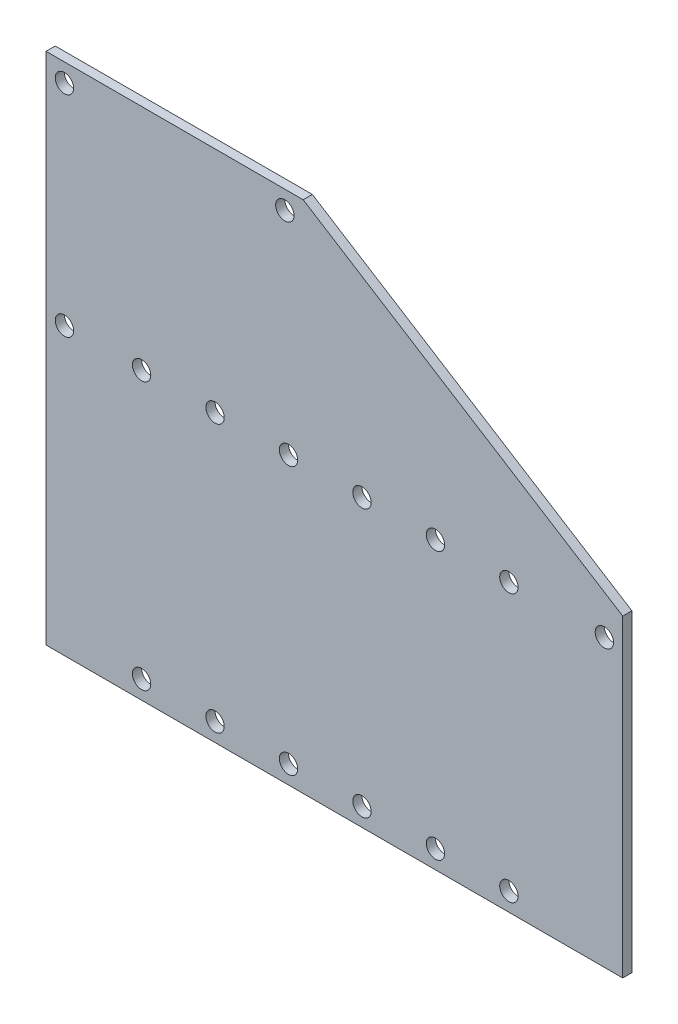
ISO-10303-21;
HEADER;
FILE_DESCRIPTION(('STEP AP214'),'2;1');
FILE_NAME('part.step','',(''),(''),'','','');
FILE_SCHEMA(('AUTOMOTIVE_DESIGN { 1 0 10303 214 1 1 1 1 }'));
ENDSEC;
DATA;
#1=APPLICATION_CONTEXT('core data for automotive mechanical design processes');
#2=APPLICATION_PROTOCOL_DEFINITION('international standard','automotive_design',2000,#1);
#3=PRODUCT_CONTEXT('',#1,'mechanical');
#4=PRODUCT('Part','Part','',(#3));
#5=PRODUCT_RELATED_PRODUCT_CATEGORY('part','',(#4));
#6=PRODUCT_DEFINITION_FORMATION('','',#4);
#7=PRODUCT_DEFINITION_CONTEXT('part definition',#1,'design');
#8=PRODUCT_DEFINITION('design','',#6,#7);
#9=PRODUCT_DEFINITION_SHAPE('','',#8);
#10=(LENGTH_UNIT() NAMED_UNIT(*) SI_UNIT(.MILLI.,.METRE.));
#11=(NAMED_UNIT(*) PLANE_ANGLE_UNIT() SI_UNIT($,.RADIAN.));
#12=(NAMED_UNIT(*) SI_UNIT($,.STERADIAN.) SOLID_ANGLE_UNIT());
#13=UNCERTAINTY_MEASURE_WITH_UNIT(LENGTH_MEASURE(1.E-05),#10,'distance_accuracy_value','');
#14=(GEOMETRIC_REPRESENTATION_CONTEXT(3) GLOBAL_UNCERTAINTY_ASSIGNED_CONTEXT((#13)) GLOBAL_UNIT_ASSIGNED_CONTEXT((#10,
#11,#12)) REPRESENTATION_CONTEXT('',''));
#15=CARTESIAN_POINT('',(0.,0.,0.));
#16=DIRECTION('',(0.,0.,1.));
#17=DIRECTION('',(1.,0.,0.));
#18=AXIS2_PLACEMENT_3D('',#15,#16,#17);
#19=CARTESIAN_POINT('',(-99.695,-88.9,3.175));
#20=DIRECTION('',(-1.,0.,0.));
#21=DIRECTION('',(0.,0.,1.));
#22=AXIS2_PLACEMENT_3D('',#19,#20,#21);
#23=PLANE('',#22);
#24=DIRECTION('',(0.,1.,0.));
#25=VECTOR('',#24,1.);
#26=CARTESIAN_POINT('',(-99.695,-88.9,0.));
#27=LINE('',#26,#25);
#28=CARTESIAN_POINT('',(-99.695,-88.9,0.));
#29=VERTEX_POINT('',#28);
#30=CARTESIAN_POINT('',(-99.695,88.9,0.));
#31=VERTEX_POINT('',#30);
#32=EDGE_CURVE('E106',#29,#31,#27,.T.);
#33=ORIENTED_EDGE('',*,*,#32,.F.);
#34=DIRECTION('',(0.,0.,-1.));
#35=VECTOR('',#34,1.);
#36=CARTESIAN_POINT('',(-99.695,-88.9,3.175));
#37=LINE('',#36,#35);
#38=CARTESIAN_POINT('',(-99.695,-88.9,3.175));
#39=VERTEX_POINT('',#38);
#40=EDGE_CURVE('E11',#39,#29,#37,.T.);
#41=ORIENTED_EDGE('',*,*,#40,.F.);
#42=DIRECTION('',(0.,1.,0.));
#43=VECTOR('',#42,1.);
#44=CARTESIAN_POINT('',(-99.695,-88.9,3.175));
#45=LINE('',#44,#43);
#46=CARTESIAN_POINT('',(-99.695,88.9,3.175));
#47=VERTEX_POINT('',#46);
#48=EDGE_CURVE('E116',#39,#47,#45,.T.);
#49=ORIENTED_EDGE('',*,*,#48,.T.);
#50=DIRECTION('',(0.,0.,-1.));
#51=VECTOR('',#50,1.);
#52=CARTESIAN_POINT('',(-99.695,88.9,3.175));
#53=LINE('',#52,#51);
#54=EDGE_CURVE('E44',#47,#31,#53,.T.);
#55=ORIENTED_EDGE('',*,*,#54,.T.);
#56=EDGE_LOOP('',(#33,#41,#49,#55));
#57=FACE_BOUND('',#56,.T.);
#58=ADVANCED_FACE('F41',(#57),#23,.T.);
#59=CARTESIAN_POINT('',(-99.695,-88.9,3.175));
#60=DIRECTION('',(0.,1.,0.));
#61=DIRECTION('',(0.,0.,1.));
#62=AXIS2_PLACEMENT_3D('',#59,#60,#61);
#63=PLANE('',#62);
#64=DIRECTION('',(1.,0.,0.));
#65=VECTOR('',#64,1.);
#66=CARTESIAN_POINT('',(-99.695,-88.9,0.));
#67=LINE('',#66,#65);
#68=CARTESIAN_POINT('',(99.695,-88.9,0.));
#69=VERTEX_POINT('',#68);
#70=EDGE_CURVE('E111',#29,#69,#67,.T.);
#71=ORIENTED_EDGE('',*,*,#70,.T.);
#72=DIRECTION('',(0.,0.,-1.));
#73=VECTOR('',#72,1.);
#74=CARTESIAN_POINT('',(99.695,-88.9,3.175));
#75=LINE('',#74,#73);
#76=CARTESIAN_POINT('',(99.695,-88.9,3.175));
#77=VERTEX_POINT('',#76);
#78=EDGE_CURVE('E49',#77,#69,#75,.T.);
#79=ORIENTED_EDGE('',*,*,#78,.F.);
#80=DIRECTION('',(1.,0.,0.));
#81=VECTOR('',#80,1.);
#82=CARTESIAN_POINT('',(-99.695,-88.9,3.175));
#83=LINE('',#82,#81);
#84=EDGE_CURVE('E121',#39,#77,#83,.T.);
#85=ORIENTED_EDGE('',*,*,#84,.F.);
#86=ORIENTED_EDGE('',*,*,#40,.T.);
#87=EDGE_LOOP('',(#71,#79,#85,#86));
#88=FACE_BOUND('',#87,.T.);
#89=ADVANCED_FACE('F247',(#88),#63,.F.);
#90=CARTESIAN_POINT('',(99.695,-88.9,3.175));
#91=DIRECTION('',(-1.,0.,0.));
#92=DIRECTION('',(0.,0.,1.));
#93=AXIS2_PLACEMENT_3D('',#90,#91,#92);
#94=PLANE('',#93);
#95=DIRECTION('',(0.,1.,0.));
#96=VECTOR('',#95,1.);
#97=CARTESIAN_POINT('',(99.695,-88.9,0.));
#98=LINE('',#97,#96);
#99=CARTESIAN_POINT('',(99.695,19.474999912,0.));
#100=VERTEX_POINT('',#99);
#101=EDGE_CURVE('E109',#69,#100,#98,.T.);
#102=ORIENTED_EDGE('',*,*,#101,.T.);
#103=DIRECTION('',(0.,0.,1.));
#104=VECTOR('',#103,1.);
#105=CARTESIAN_POINT('',(99.695,19.474999912,0.));
#106=LINE('',#105,#104);
#107=CARTESIAN_POINT('',(99.695,19.474999912,3.175));
#108=VERTEX_POINT('',#107);
#109=EDGE_CURVE('E57',#100,#108,#106,.T.);
#110=ORIENTED_EDGE('',*,*,#109,.T.);
#111=DIRECTION('',(0.,1.,0.));
#112=VECTOR('',#111,1.);
#113=CARTESIAN_POINT('',(99.695,-88.9,3.175));
#114=LINE('',#113,#112);
#115=EDGE_CURVE('E122',#77,#108,#114,.T.);
#116=ORIENTED_EDGE('',*,*,#115,.F.);
#117=ORIENTED_EDGE('',*,*,#78,.T.);
#118=EDGE_LOOP('',(#102,#110,#116,#117));
#119=FACE_BOUND('',#118,.T.);
#120=ADVANCED_FACE('F245',(#119),#94,.F.);
#121=CARTESIAN_POINT('',(-99.695,88.9,3.175));
#122=DIRECTION('',(0.,1.,0.));
#123=DIRECTION('',(0.,0.,1.));
#124=AXIS2_PLACEMENT_3D('',#121,#122,#123);
#125=PLANE('',#124);
#126=DIRECTION('',(0.,0.,1.));
#127=VECTOR('',#126,1.);
#128=CARTESIAN_POINT('',(-10.795,88.9,0.));
#129=LINE('',#128,#127);
#130=CARTESIAN_POINT('',(-10.795,88.9,0.));
#131=VERTEX_POINT('',#130);
#132=CARTESIAN_POINT('',(-10.795,88.9,3.175));
#133=VERTEX_POINT('',#132);
#134=EDGE_CURVE('E94',#131,#133,#129,.T.);
#135=ORIENTED_EDGE('',*,*,#134,.F.);
#136=DIRECTION('',(1.,0.,0.));
#137=VECTOR('',#136,1.);
#138=CARTESIAN_POINT('',(-99.695,88.9,0.));
#139=LINE('',#138,#137);
#140=EDGE_CURVE('E103',#31,#131,#139,.T.);
#141=ORIENTED_EDGE('',*,*,#140,.F.);
#142=ORIENTED_EDGE('',*,*,#54,.F.);
#143=DIRECTION('',(1.,0.,0.));
#144=VECTOR('',#143,1.);
#145=CARTESIAN_POINT('',(-99.695,88.9,3.175));
#146=LINE('',#145,#144);
#147=EDGE_CURVE('E105',#47,#133,#146,.T.);
#148=ORIENTED_EDGE('',*,*,#147,.T.);
#149=EDGE_LOOP('',(#135,#141,#142,#148));
#150=FACE_BOUND('',#149,.T.);
#151=ADVANCED_FACE('F102',(#150),#125,.T.);
#152=CARTESIAN_POINT('',(0.,0.,3.175));
#153=DIRECTION('',(0.,0.,-1.));
#154=DIRECTION('',(-1.,0.,0.));
#155=AXIS2_PLACEMENT_3D('',#152,#153,#154);
#156=PLANE('',#155);
#157=CARTESIAN_POINT('',(-66.675,9.94999991200002,3.175));
#158=DIRECTION('',(0.,0.,1.));
#159=DIRECTION('',(1.,0.,0.));
#160=AXIS2_PLACEMENT_3D('',#157,#158,#159);
#161=CIRCLE('',#160,3.175);
#162=CARTESIAN_POINT('',(-63.5,9.94999991200002,3.175));
#163=VERTEX_POINT('',#162);
#164=EDGE_CURVE('E155',#163,#163,#161,.T.);
#165=ORIENTED_EDGE('',*,*,#164,.F.);
#166=EDGE_LOOP('',(#165));
#167=FACE_BOUND('',#166,.T.);
#168=CARTESIAN_POINT('',(-17.145,82.55,3.175));
#169=DIRECTION('',(0.,0.,1.));
#170=DIRECTION('',(1.,0.,0.));
#171=AXIS2_PLACEMENT_3D('',#168,#169,#170);
#172=CIRCLE('',#171,3.175);
#173=CARTESIAN_POINT('',(-13.97,82.55,3.175));
#174=VERTEX_POINT('',#173);
#175=EDGE_CURVE('E166',#174,#174,#172,.T.);
#176=ORIENTED_EDGE('',*,*,#175,.F.);
#177=EDGE_LOOP('',(#176));
#178=FACE_BOUND('',#177,.T.);
#179=CARTESIAN_POINT('',(-41.275,9.94999991200002,3.175));
#180=DIRECTION('',(0.,0.,1.));
#181=DIRECTION('',(1.,0.,0.));
#182=AXIS2_PLACEMENT_3D('',#179,#180,#181);
#183=CIRCLE('',#182,3.175);
#184=CARTESIAN_POINT('',(-38.1,9.94999991200002,3.175));
#185=VERTEX_POINT('',#184);
#186=EDGE_CURVE('E167',#185,#185,#183,.T.);
#187=ORIENTED_EDGE('',*,*,#186,.F.);
#188=EDGE_LOOP('',(#187));
#189=FACE_BOUND('',#188,.T.);
#190=CARTESIAN_POINT('',(-15.875,9.94999991200002,3.175));
#191=DIRECTION('',(0.,0.,1.));
#192=DIRECTION('',(1.,0.,0.));
#193=AXIS2_PLACEMENT_3D('',#190,#191,#192);
#194=CIRCLE('',#193,3.175);
#195=CARTESIAN_POINT('',(-12.7,9.94999991200002,3.175));
#196=VERTEX_POINT('',#195);
#197=EDGE_CURVE('E178',#196,#196,#194,.T.);
#198=ORIENTED_EDGE('',*,*,#197,.F.);
#199=EDGE_LOOP('',(#198));
#200=FACE_BOUND('',#199,.T.);
#201=CARTESIAN_POINT('',(-41.275,-82.55,3.175));
#202=DIRECTION('',(0.,0.,1.));
#203=DIRECTION('',(1.,0.,0.));
#204=AXIS2_PLACEMENT_3D('',#201,#202,#203);
#205=CIRCLE('',#204,3.175);
#206=CARTESIAN_POINT('',(-38.1,-82.55,3.175));
#207=VERTEX_POINT('',#206);
#208=EDGE_CURVE('E136',#207,#207,#205,.T.);
#209=ORIENTED_EDGE('',*,*,#208,.F.);
#210=EDGE_LOOP('',(#209));
#211=FACE_BOUND('',#210,.T.);
#212=CARTESIAN_POINT('',(-93.345,82.55,3.175));
#213=DIRECTION('',(0.,0.,1.));
#214=DIRECTION('',(1.,0.,0.));
#215=AXIS2_PLACEMENT_3D('',#212,#213,#214);
#216=CIRCLE('',#215,3.175);
#217=CARTESIAN_POINT('',(-90.17,82.55,3.175));
#218=VERTEX_POINT('',#217);
#219=EDGE_CURVE('E142',#218,#218,#216,.T.);
#220=ORIENTED_EDGE('',*,*,#219,.F.);
#221=EDGE_LOOP('',(#220));
#222=FACE_BOUND('',#221,.T.);
#223=CARTESIAN_POINT('',(-93.345,9.94999991200002,3.175));
#224=DIRECTION('',(0.,0.,1.));
#225=DIRECTION('',(1.,0.,0.));
#226=AXIS2_PLACEMENT_3D('',#223,#224,#225);
#227=CIRCLE('',#226,3.175);
#228=CARTESIAN_POINT('',(-90.17,9.94999991200002,3.175));
#229=VERTEX_POINT('',#228);
#230=EDGE_CURVE('E143',#229,#229,#227,.T.);
#231=ORIENTED_EDGE('',*,*,#230,.F.);
#232=EDGE_LOOP('',(#231));
#233=FACE_BOUND('',#232,.T.);
#234=CARTESIAN_POINT('',(93.345,9.94999991200002,3.175));
#235=DIRECTION('',(0.,0.,1.));
#236=DIRECTION('',(1.,0.,0.));
#237=AXIS2_PLACEMENT_3D('',#234,#235,#236);
#238=CIRCLE('',#237,3.175);
#239=CARTESIAN_POINT('',(96.52,9.94999991200002,3.175));
#240=VERTEX_POINT('',#239);
#241=EDGE_CURVE('E154',#240,#240,#238,.T.);
#242=ORIENTED_EDGE('',*,*,#241,.F.);
#243=EDGE_LOOP('',(#242));
#244=FACE_BOUND('',#243,.T.);
#245=CARTESIAN_POINT('',(60.325,-82.55,3.175));
#246=DIRECTION('',(0.,0.,1.));
#247=DIRECTION('',(1.,0.,0.));
#248=AXIS2_PLACEMENT_3D('',#245,#246,#247);
#249=CIRCLE('',#248,3.175);
#250=CARTESIAN_POINT('',(63.5,-82.55,3.175));
#251=VERTEX_POINT('',#250);
#252=EDGE_CURVE('E214',#251,#251,#249,.T.);
#253=ORIENTED_EDGE('',*,*,#252,.F.);
#254=EDGE_LOOP('',(#253));
#255=FACE_BOUND('',#254,.T.);
#256=CARTESIAN_POINT('',(34.925,-82.55,3.175));
#257=DIRECTION('',(0.,0.,1.));
#258=DIRECTION('',(1.,0.,0.));
#259=AXIS2_PLACEMENT_3D('',#256,#257,#258);
#260=CIRCLE('',#259,3.175);
#261=CARTESIAN_POINT('',(38.1,-82.55,3.175));
#262=VERTEX_POINT('',#261);
#263=EDGE_CURVE('E220',#262,#262,#260,.T.);
#264=ORIENTED_EDGE('',*,*,#263,.F.);
#265=EDGE_LOOP('',(#264));
#266=FACE_BOUND('',#265,.T.);
#267=CARTESIAN_POINT('',(9.52499999999998,-82.55,3.175));
#268=DIRECTION('',(0.,0.,1.));
#269=DIRECTION('',(1.,0.,0.));
#270=AXIS2_PLACEMENT_3D('',#267,#268,#269);
#271=CIRCLE('',#270,3.175);
#272=CARTESIAN_POINT('',(12.7,-82.55,3.175));
#273=VERTEX_POINT('',#272);
#274=EDGE_CURVE('E203',#273,#273,#271,.T.);
#275=ORIENTED_EDGE('',*,*,#274,.F.);
#276=EDGE_LOOP('',(#275));
#277=FACE_BOUND('',#276,.T.);
#278=CARTESIAN_POINT('',(9.52499999999995,9.94999991200002,3.175));
#279=DIRECTION('',(0.,0.,1.));
#280=DIRECTION('',(1.,0.,0.));
#281=AXIS2_PLACEMENT_3D('',#278,#279,#280);
#282=CIRCLE('',#281,3.175);
#283=CARTESIAN_POINT('',(12.6999999999999,9.94999991200002,3.175));
#284=VERTEX_POINT('',#283);
#285=EDGE_CURVE('E179',#284,#284,#282,.T.);
#286=ORIENTED_EDGE('',*,*,#285,.F.);
#287=EDGE_LOOP('',(#286));
#288=FACE_BOUND('',#287,.T.);
#289=CARTESIAN_POINT('',(34.9249999999999,9.94999991200002,3.175));
#290=DIRECTION('',(0.,0.,1.));
#291=DIRECTION('',(1.,0.,0.));
#292=AXIS2_PLACEMENT_3D('',#289,#290,#291);
#293=CIRCLE('',#292,3.175);
#294=CARTESIAN_POINT('',(38.0999999999999,9.94999991200002,3.175));
#295=VERTEX_POINT('',#294);
#296=EDGE_CURVE('E190',#295,#295,#293,.T.);
#297=ORIENTED_EDGE('',*,*,#296,.F.);
#298=EDGE_LOOP('',(#297));
#299=FACE_BOUND('',#298,.T.);
#300=CARTESIAN_POINT('',(60.3249999999999,9.94999991200002,3.175));
#301=DIRECTION('',(0.,0.,1.));
#302=DIRECTION('',(1.,0.,0.));
#303=AXIS2_PLACEMENT_3D('',#300,#301,#302);
#304=CIRCLE('',#303,3.175);
#305=CARTESIAN_POINT('',(63.4999999999999,9.94999991200002,3.175));
#306=VERTEX_POINT('',#305);
#307=EDGE_CURVE('E191',#306,#306,#304,.T.);
#308=ORIENTED_EDGE('',*,*,#307,.F.);
#309=EDGE_LOOP('',(#308));
#310=FACE_BOUND('',#309,.T.);
#311=CARTESIAN_POINT('',(-15.875,-82.55,3.175));
#312=DIRECTION('',(0.,0.,1.));
#313=DIRECTION('',(1.,0.,0.));
#314=AXIS2_PLACEMENT_3D('',#311,#312,#313);
#315=CIRCLE('',#314,3.175);
#316=CARTESIAN_POINT('',(-12.7,-82.55,3.175));
#317=VERTEX_POINT('',#316);
#318=EDGE_CURVE('E202',#317,#317,#315,.T.);
#319=ORIENTED_EDGE('',*,*,#318,.F.);
#320=EDGE_LOOP('',(#319));
#321=FACE_BOUND('',#320,.T.);
#322=CARTESIAN_POINT('',(-66.675,-82.55,3.175));
#323=DIRECTION('',(0.,0.,1.));
#324=DIRECTION('',(1.,0.,0.));
#325=AXIS2_PLACEMENT_3D('',#322,#323,#324);
#326=CIRCLE('',#325,3.175);
#327=CARTESIAN_POINT('',(-63.5,-82.55,3.175));
#328=VERTEX_POINT('',#327);
#329=EDGE_CURVE('E133',#328,#328,#326,.T.);
#330=ORIENTED_EDGE('',*,*,#329,.F.);
#331=EDGE_LOOP('',(#330));
#332=FACE_BOUND('',#331,.T.);
#333=ORIENTED_EDGE('',*,*,#115,.T.);
#334=DIRECTION('',(0.846725815933061,-0.532029503535746,0.));
#335=VECTOR('',#334,1.);
#336=CARTESIAN_POINT('',(-10.795,88.9,3.175));
#337=LINE('',#336,#335);
#338=EDGE_CURVE('E100',#133,#108,#337,.T.);
#339=ORIENTED_EDGE('',*,*,#338,.F.);
#340=ORIENTED_EDGE('',*,*,#147,.F.);
#341=ORIENTED_EDGE('',*,*,#48,.F.);
#342=ORIENTED_EDGE('',*,*,#84,.T.);
#343=EDGE_LOOP('',(#333,#339,#340,#341,#342));
#344=FACE_BOUND('',#343,.T.);
#345=ADVANCED_FACE('F231',(#167,#178,#189,#200,#211,#222,#233,#244,#255,#266,#277,#288,#299,
#310,#321,#332,#344),#156,.F.);
#346=CARTESIAN_POINT('',(0.,0.,0.));
#347=DIRECTION('',(0.,0.,-1.));
#348=DIRECTION('',(-1.,0.,0.));
#349=AXIS2_PLACEMENT_3D('',#346,#347,#348);
#350=PLANE('',#349);
#351=CARTESIAN_POINT('',(-66.675,9.94999991200002,0.));
#352=DIRECTION('',(0.,0.,1.));
#353=DIRECTION('',(1.,0.,0.));
#354=AXIS2_PLACEMENT_3D('',#351,#352,#353);
#355=CIRCLE('',#354,3.175);
#356=CARTESIAN_POINT('',(-63.5,9.94999991200002,0.));
#357=VERTEX_POINT('',#356);
#358=EDGE_CURVE('E170',#357,#357,#355,.T.);
#359=ORIENTED_EDGE('',*,*,#358,.T.);
#360=EDGE_LOOP('',(#359));
#361=FACE_BOUND('',#360,.T.);
#362=CARTESIAN_POINT('',(-17.145,82.55,0.));
#363=DIRECTION('',(0.,0.,1.));
#364=DIRECTION('',(1.,0.,0.));
#365=AXIS2_PLACEMENT_3D('',#362,#363,#364);
#366=CIRCLE('',#365,3.175);
#367=CARTESIAN_POINT('',(-13.97,82.55,0.));
#368=VERTEX_POINT('',#367);
#369=EDGE_CURVE('E163',#368,#368,#366,.T.);
#370=ORIENTED_EDGE('',*,*,#369,.T.);
#371=EDGE_LOOP('',(#370));
#372=FACE_BOUND('',#371,.T.);
#373=CARTESIAN_POINT('',(-41.275,9.94999991200002,0.));
#374=DIRECTION('',(0.,0.,1.));
#375=DIRECTION('',(1.,0.,0.));
#376=AXIS2_PLACEMENT_3D('',#373,#374,#375);
#377=CIRCLE('',#376,3.175);
#378=CARTESIAN_POINT('',(-38.1,9.94999991200002,0.));
#379=VERTEX_POINT('',#378);
#380=EDGE_CURVE('E182',#379,#379,#377,.T.);
#381=ORIENTED_EDGE('',*,*,#380,.T.);
#382=EDGE_LOOP('',(#381));
#383=FACE_BOUND('',#382,.T.);
#384=CARTESIAN_POINT('',(-15.875,9.94999991200002,0.));
#385=DIRECTION('',(0.,0.,1.));
#386=DIRECTION('',(1.,0.,0.));
#387=AXIS2_PLACEMENT_3D('',#384,#385,#386);
#388=CIRCLE('',#387,3.175);
#389=CARTESIAN_POINT('',(-12.7,9.94999991200002,0.));
#390=VERTEX_POINT('',#389);
#391=EDGE_CURVE('E175',#390,#390,#388,.T.);
#392=ORIENTED_EDGE('',*,*,#391,.T.);
#393=EDGE_LOOP('',(#392));
#394=FACE_BOUND('',#393,.T.);
#395=CARTESIAN_POINT('',(-41.275,-82.55,0.));
#396=DIRECTION('',(0.,0.,1.));
#397=DIRECTION('',(1.,0.,0.));
#398=AXIS2_PLACEMENT_3D('',#395,#396,#397);
#399=CIRCLE('',#398,3.175);
#400=CARTESIAN_POINT('',(-38.1,-82.55,0.));
#401=VERTEX_POINT('',#400);
#402=EDGE_CURVE('E146',#401,#401,#399,.T.);
#403=ORIENTED_EDGE('',*,*,#402,.T.);
#404=EDGE_LOOP('',(#403));
#405=FACE_BOUND('',#404,.T.);
#406=CARTESIAN_POINT('',(-93.345,82.55,0.));
#407=DIRECTION('',(0.,0.,1.));
#408=DIRECTION('',(1.,0.,0.));
#409=AXIS2_PLACEMENT_3D('',#406,#407,#408);
#410=CIRCLE('',#409,3.175);
#411=CARTESIAN_POINT('',(-90.17,82.55,0.));
#412=VERTEX_POINT('',#411);
#413=EDGE_CURVE('E139',#412,#412,#410,.T.);
#414=ORIENTED_EDGE('',*,*,#413,.T.);
#415=EDGE_LOOP('',(#414));
#416=FACE_BOUND('',#415,.T.);
#417=CARTESIAN_POINT('',(-93.345,9.94999991200002,0.));
#418=DIRECTION('',(0.,0.,1.));
#419=DIRECTION('',(1.,0.,0.));
#420=AXIS2_PLACEMENT_3D('',#417,#418,#419);
#421=CIRCLE('',#420,3.175);
#422=CARTESIAN_POINT('',(-90.17,9.94999991200002,0.));
#423=VERTEX_POINT('',#422);
#424=EDGE_CURVE('E158',#423,#423,#421,.T.);
#425=ORIENTED_EDGE('',*,*,#424,.T.);
#426=EDGE_LOOP('',(#425));
#427=FACE_BOUND('',#426,.T.);
#428=CARTESIAN_POINT('',(93.345,9.94999991200002,0.));
#429=DIRECTION('',(0.,0.,1.));
#430=DIRECTION('',(1.,0.,0.));
#431=AXIS2_PLACEMENT_3D('',#428,#429,#430);
#432=CIRCLE('',#431,3.175);
#433=CARTESIAN_POINT('',(96.52,9.94999991200002,0.));
#434=VERTEX_POINT('',#433);
#435=EDGE_CURVE('E151',#434,#434,#432,.T.);
#436=ORIENTED_EDGE('',*,*,#435,.T.);
#437=EDGE_LOOP('',(#436));
#438=FACE_BOUND('',#437,.T.);
#439=CARTESIAN_POINT('',(60.325,-82.55,0.));
#440=DIRECTION('',(0.,0.,1.));
#441=DIRECTION('',(1.,0.,0.));
#442=AXIS2_PLACEMENT_3D('',#439,#440,#441);
#443=CIRCLE('',#442,3.175);
#444=CARTESIAN_POINT('',(63.5,-82.55,0.));
#445=VERTEX_POINT('',#444);
#446=EDGE_CURVE('E211',#445,#445,#443,.T.);
#447=ORIENTED_EDGE('',*,*,#446,.T.);
#448=EDGE_LOOP('',(#447));
#449=FACE_BOUND('',#448,.T.);
#450=CARTESIAN_POINT('',(34.925,-82.55,0.));
#451=DIRECTION('',(0.,0.,1.));
#452=DIRECTION('',(1.,0.,0.));
#453=AXIS2_PLACEMENT_3D('',#450,#451,#452);
#454=CIRCLE('',#453,3.175);
#455=CARTESIAN_POINT('',(38.1,-82.55,0.));
#456=VERTEX_POINT('',#455);
#457=EDGE_CURVE('E217',#456,#456,#454,.T.);
#458=ORIENTED_EDGE('',*,*,#457,.T.);
#459=EDGE_LOOP('',(#458));
#460=FACE_BOUND('',#459,.T.);
#461=CARTESIAN_POINT('',(9.52499999999998,-82.55,0.));
#462=DIRECTION('',(0.,0.,1.));
#463=DIRECTION('',(1.,0.,0.));
#464=AXIS2_PLACEMENT_3D('',#461,#462,#463);
#465=CIRCLE('',#464,3.175);
#466=CARTESIAN_POINT('',(12.7,-82.55,0.));
#467=VERTEX_POINT('',#466);
#468=EDGE_CURVE('E223',#467,#467,#465,.T.);
#469=ORIENTED_EDGE('',*,*,#468,.T.);
#470=EDGE_LOOP('',(#469));
#471=FACE_BOUND('',#470,.T.);
#472=CARTESIAN_POINT('',(9.52499999999995,9.94999991200002,0.));
#473=DIRECTION('',(0.,0.,1.));
#474=DIRECTION('',(1.,0.,0.));
#475=AXIS2_PLACEMENT_3D('',#472,#473,#474);
#476=CIRCLE('',#475,3.175);
#477=CARTESIAN_POINT('',(12.6999999999999,9.94999991200002,0.));
#478=VERTEX_POINT('',#477);
#479=EDGE_CURVE('E194',#478,#478,#476,.T.);
#480=ORIENTED_EDGE('',*,*,#479,.T.);
#481=EDGE_LOOP('',(#480));
#482=FACE_BOUND('',#481,.T.);
#483=CARTESIAN_POINT('',(34.9249999999999,9.94999991200002,0.));
#484=DIRECTION('',(0.,0.,1.));
#485=DIRECTION('',(1.,0.,0.));
#486=AXIS2_PLACEMENT_3D('',#483,#484,#485);
#487=CIRCLE('',#486,3.175);
#488=CARTESIAN_POINT('',(38.0999999999999,9.94999991200002,0.));
#489=VERTEX_POINT('',#488);
#490=EDGE_CURVE('E187',#489,#489,#487,.T.);
#491=ORIENTED_EDGE('',*,*,#490,.T.);
#492=EDGE_LOOP('',(#491));
#493=FACE_BOUND('',#492,.T.);
#494=CARTESIAN_POINT('',(60.3249999999999,9.94999991200002,0.));
#495=DIRECTION('',(0.,0.,1.));
#496=DIRECTION('',(1.,0.,0.));
#497=AXIS2_PLACEMENT_3D('',#494,#495,#496);
#498=CIRCLE('',#497,3.175);
#499=CARTESIAN_POINT('',(63.4999999999999,9.94999991200002,0.));
#500=VERTEX_POINT('',#499);
#501=EDGE_CURVE('E206',#500,#500,#498,.T.);
#502=ORIENTED_EDGE('',*,*,#501,.T.);
#503=EDGE_LOOP('',(#502));
#504=FACE_BOUND('',#503,.T.);
#505=CARTESIAN_POINT('',(-15.875,-82.55,0.));
#506=DIRECTION('',(0.,0.,1.));
#507=DIRECTION('',(1.,0.,0.));
#508=AXIS2_PLACEMENT_3D('',#505,#506,#507);
#509=CIRCLE('',#508,3.175);
#510=CARTESIAN_POINT('',(-12.7,-82.55,0.));
#511=VERTEX_POINT('',#510);
#512=EDGE_CURVE('E199',#511,#511,#509,.T.);
#513=ORIENTED_EDGE('',*,*,#512,.T.);
#514=EDGE_LOOP('',(#513));
#515=FACE_BOUND('',#514,.T.);
#516=CARTESIAN_POINT('',(-66.675,-82.55,0.));
#517=DIRECTION('',(0.,0.,1.));
#518=DIRECTION('',(1.,0.,0.));
#519=AXIS2_PLACEMENT_3D('',#516,#517,#518);
#520=CIRCLE('',#519,3.175);
#521=CARTESIAN_POINT('',(-63.5,-82.55,0.));
#522=VERTEX_POINT('',#521);
#523=EDGE_CURVE('E131',#522,#522,#520,.T.);
#524=ORIENTED_EDGE('',*,*,#523,.T.);
#525=EDGE_LOOP('',(#524));
#526=FACE_BOUND('',#525,.T.);
#527=DIRECTION('',(0.846725815933061,-0.532029503535746,0.));
#528=VECTOR('',#527,1.);
#529=CARTESIAN_POINT('',(-10.795,88.9,0.));
#530=LINE('',#529,#528);
#531=EDGE_CURVE('E91',#131,#100,#530,.T.);
#532=ORIENTED_EDGE('',*,*,#531,.T.);
#533=ORIENTED_EDGE('',*,*,#101,.F.);
#534=ORIENTED_EDGE('',*,*,#70,.F.);
#535=ORIENTED_EDGE('',*,*,#32,.T.);
#536=ORIENTED_EDGE('',*,*,#140,.T.);
#537=EDGE_LOOP('',(#532,#533,#534,#535,#536));
#538=FACE_BOUND('',#537,.T.);
#539=ADVANCED_FACE('F108',(#361,#372,#383,#394,#405,#416,#427,#438,#449,#460,#471,#482,#493,
#504,#515,#526,#538),#350,.T.);
#540=CARTESIAN_POINT('',(-10.795,88.9,0.));
#541=DIRECTION('',(-0.532029503535746,-0.846725815933061,0.));
#542=DIRECTION('',(0.846725815933061,-0.532029503535746,0.));
#543=AXIS2_PLACEMENT_3D('',#540,#541,#542);
#544=PLANE('',#543);
#545=ORIENTED_EDGE('',*,*,#338,.T.);
#546=ORIENTED_EDGE('',*,*,#109,.F.);
#547=ORIENTED_EDGE('',*,*,#531,.F.);
#548=ORIENTED_EDGE('',*,*,#134,.T.);
#549=EDGE_LOOP('',(#545,#546,#547,#548));
#550=FACE_BOUND('',#549,.T.);
#551=ADVANCED_FACE('F93',(#550),#544,.F.);
#552=CARTESIAN_POINT('',(-66.675,-82.55,0.));
#553=DIRECTION('',(0.,0.,1.));
#554=DIRECTION('',(1.,0.,0.));
#555=AXIS2_PLACEMENT_3D('',#552,#553,#554);
#556=CYLINDRICAL_SURFACE('',#555,3.175);
#557=ORIENTED_EDGE('',*,*,#523,.F.);
#558=EDGE_LOOP('',(#557));
#559=FACE_BOUND('',#558,.T.);
#560=ORIENTED_EDGE('',*,*,#329,.T.);
#561=EDGE_LOOP('',(#560));
#562=FACE_BOUND('',#561,.T.);
#563=ADVANCED_FACE('F269',(#559,#562),#556,.F.);
#564=CARTESIAN_POINT('',(-15.875,-82.55,0.));
#565=DIRECTION('',(0.,0.,1.));
#566=DIRECTION('',(1.,0.,0.));
#567=AXIS2_PLACEMENT_3D('',#564,#565,#566);
#568=CYLINDRICAL_SURFACE('',#567,3.175);
#569=ORIENTED_EDGE('',*,*,#512,.F.);
#570=EDGE_LOOP('',(#569));
#571=FACE_BOUND('',#570,.T.);
#572=ORIENTED_EDGE('',*,*,#318,.T.);
#573=EDGE_LOOP('',(#572));
#574=FACE_BOUND('',#573,.T.);
#575=ADVANCED_FACE('F289',(#571,#574),#568,.F.);
#576=CARTESIAN_POINT('',(60.3249999999999,9.94999991200002,0.));
#577=DIRECTION('',(0.,0.,1.));
#578=DIRECTION('',(1.,0.,0.));
#579=AXIS2_PLACEMENT_3D('',#576,#577,#578);
#580=CYLINDRICAL_SURFACE('',#579,3.175);
#581=ORIENTED_EDGE('',*,*,#501,.F.);
#582=EDGE_LOOP('',(#581));
#583=FACE_BOUND('',#582,.T.);
#584=ORIENTED_EDGE('',*,*,#307,.T.);
#585=EDGE_LOOP('',(#584));
#586=FACE_BOUND('',#585,.T.);
#587=ADVANCED_FACE('F298',(#583,#586),#580,.F.);
#588=CARTESIAN_POINT('',(34.9249999999999,9.94999991200002,0.));
#589=DIRECTION('',(0.,0.,1.));
#590=DIRECTION('',(1.,0.,0.));
#591=AXIS2_PLACEMENT_3D('',#588,#589,#590);
#592=CYLINDRICAL_SURFACE('',#591,3.175);
#593=ORIENTED_EDGE('',*,*,#490,.F.);
#594=EDGE_LOOP('',(#593));
#595=FACE_BOUND('',#594,.T.);
#596=ORIENTED_EDGE('',*,*,#296,.T.);
#597=EDGE_LOOP('',(#596));
#598=FACE_BOUND('',#597,.T.);
#599=ADVANCED_FACE('F307',(#595,#598),#592,.F.);
#600=CARTESIAN_POINT('',(9.52499999999995,9.94999991200002,0.));
#601=DIRECTION('',(0.,0.,1.));
#602=DIRECTION('',(1.,0.,0.));
#603=AXIS2_PLACEMENT_3D('',#600,#601,#602);
#604=CYLINDRICAL_SURFACE('',#603,3.175);
#605=ORIENTED_EDGE('',*,*,#479,.F.);
#606=EDGE_LOOP('',(#605));
#607=FACE_BOUND('',#606,.T.);
#608=ORIENTED_EDGE('',*,*,#285,.T.);
#609=EDGE_LOOP('',(#608));
#610=FACE_BOUND('',#609,.T.);
#611=ADVANCED_FACE('F316',(#607,#610),#604,.F.);
#612=CARTESIAN_POINT('',(9.52499999999998,-82.55,0.));
#613=DIRECTION('',(0.,0.,1.));
#614=DIRECTION('',(1.,0.,0.));
#615=AXIS2_PLACEMENT_3D('',#612,#613,#614);
#616=CYLINDRICAL_SURFACE('',#615,3.175);
#617=ORIENTED_EDGE('',*,*,#468,.F.);
#618=EDGE_LOOP('',(#617));
#619=FACE_BOUND('',#618,.T.);
#620=ORIENTED_EDGE('',*,*,#274,.T.);
#621=EDGE_LOOP('',(#620));
#622=FACE_BOUND('',#621,.T.);
#623=ADVANCED_FACE('F229',(#619,#622),#616,.F.);
#624=CARTESIAN_POINT('',(34.925,-82.55,0.));
#625=DIRECTION('',(0.,0.,1.));
#626=DIRECTION('',(1.,0.,0.));
#627=AXIS2_PLACEMENT_3D('',#624,#625,#626);
#628=CYLINDRICAL_SURFACE('',#627,3.175);
#629=ORIENTED_EDGE('',*,*,#457,.F.);
#630=EDGE_LOOP('',(#629));
#631=FACE_BOUND('',#630,.T.);
#632=ORIENTED_EDGE('',*,*,#263,.T.);
#633=EDGE_LOOP('',(#632));
#634=FACE_BOUND('',#633,.T.);
#635=ADVANCED_FACE('F333',(#631,#634),#628,.F.);
#636=CARTESIAN_POINT('',(60.325,-82.55,0.));
#637=DIRECTION('',(0.,0.,1.));
#638=DIRECTION('',(1.,0.,0.));
#639=AXIS2_PLACEMENT_3D('',#636,#637,#638);
#640=CYLINDRICAL_SURFACE('',#639,3.175);
#641=ORIENTED_EDGE('',*,*,#446,.F.);
#642=EDGE_LOOP('',(#641));
#643=FACE_BOUND('',#642,.T.);
#644=ORIENTED_EDGE('',*,*,#252,.T.);
#645=EDGE_LOOP('',(#644));
#646=FACE_BOUND('',#645,.T.);
#647=ADVANCED_FACE('F342',(#643,#646),#640,.F.);
#648=CARTESIAN_POINT('',(93.345,9.94999991200002,0.));
#649=DIRECTION('',(0.,0.,1.));
#650=DIRECTION('',(1.,0.,0.));
#651=AXIS2_PLACEMENT_3D('',#648,#649,#650);
#652=CYLINDRICAL_SURFACE('',#651,3.175);
#653=ORIENTED_EDGE('',*,*,#435,.F.);
#654=EDGE_LOOP('',(#653));
#655=FACE_BOUND('',#654,.T.);
#656=ORIENTED_EDGE('',*,*,#241,.T.);
#657=EDGE_LOOP('',(#656));
#658=FACE_BOUND('',#657,.T.);
#659=ADVANCED_FACE('F351',(#655,#658),#652,.F.);
#660=CARTESIAN_POINT('',(-93.345,9.94999991200002,0.));
#661=DIRECTION('',(0.,0.,1.));
#662=DIRECTION('',(1.,0.,0.));
#663=AXIS2_PLACEMENT_3D('',#660,#661,#662);
#664=CYLINDRICAL_SURFACE('',#663,3.175);
#665=ORIENTED_EDGE('',*,*,#424,.F.);
#666=EDGE_LOOP('',(#665));
#667=FACE_BOUND('',#666,.T.);
#668=ORIENTED_EDGE('',*,*,#230,.T.);
#669=EDGE_LOOP('',(#668));
#670=FACE_BOUND('',#669,.T.);
#671=ADVANCED_FACE('F360',(#667,#670),#664,.F.);
#672=CARTESIAN_POINT('',(-93.345,82.55,0.));
#673=DIRECTION('',(0.,0.,1.));
#674=DIRECTION('',(1.,0.,0.));
#675=AXIS2_PLACEMENT_3D('',#672,#673,#674);
#676=CYLINDRICAL_SURFACE('',#675,3.175);
#677=ORIENTED_EDGE('',*,*,#413,.F.);
#678=EDGE_LOOP('',(#677));
#679=FACE_BOUND('',#678,.T.);
#680=ORIENTED_EDGE('',*,*,#219,.T.);
#681=EDGE_LOOP('',(#680));
#682=FACE_BOUND('',#681,.T.);
#683=ADVANCED_FACE('F369',(#679,#682),#676,.F.);
#684=CARTESIAN_POINT('',(-41.275,-82.55,0.));
#685=DIRECTION('',(0.,0.,1.));
#686=DIRECTION('',(1.,0.,0.));
#687=AXIS2_PLACEMENT_3D('',#684,#685,#686);
#688=CYLINDRICAL_SURFACE('',#687,3.175);
#689=ORIENTED_EDGE('',*,*,#402,.F.);
#690=EDGE_LOOP('',(#689));
#691=FACE_BOUND('',#690,.T.);
#692=ORIENTED_EDGE('',*,*,#208,.T.);
#693=EDGE_LOOP('',(#692));
#694=FACE_BOUND('',#693,.T.);
#695=ADVANCED_FACE('F378',(#691,#694),#688,.F.);
#696=CARTESIAN_POINT('',(-15.875,9.94999991200002,0.));
#697=DIRECTION('',(0.,0.,1.));
#698=DIRECTION('',(1.,0.,0.));
#699=AXIS2_PLACEMENT_3D('',#696,#697,#698);
#700=CYLINDRICAL_SURFACE('',#699,3.175);
#701=ORIENTED_EDGE('',*,*,#391,.F.);
#702=EDGE_LOOP('',(#701));
#703=FACE_BOUND('',#702,.T.);
#704=ORIENTED_EDGE('',*,*,#197,.T.);
#705=EDGE_LOOP('',(#704));
#706=FACE_BOUND('',#705,.T.);
#707=ADVANCED_FACE('F387',(#703,#706),#700,.F.);
#708=CARTESIAN_POINT('',(-41.275,9.94999991200002,0.));
#709=DIRECTION('',(0.,0.,1.));
#710=DIRECTION('',(1.,0.,0.));
#711=AXIS2_PLACEMENT_3D('',#708,#709,#710);
#712=CYLINDRICAL_SURFACE('',#711,3.175);
#713=ORIENTED_EDGE('',*,*,#380,.F.);
#714=EDGE_LOOP('',(#713));
#715=FACE_BOUND('',#714,.T.);
#716=ORIENTED_EDGE('',*,*,#186,.T.);
#717=EDGE_LOOP('',(#716));
#718=FACE_BOUND('',#717,.T.);
#719=ADVANCED_FACE('F396',(#715,#718),#712,.F.);
#720=CARTESIAN_POINT('',(-17.145,82.55,0.));
#721=DIRECTION('',(0.,0.,1.));
#722=DIRECTION('',(1.,0.,0.));
#723=AXIS2_PLACEMENT_3D('',#720,#721,#722);
#724=CYLINDRICAL_SURFACE('',#723,3.175);
#725=ORIENTED_EDGE('',*,*,#369,.F.);
#726=EDGE_LOOP('',(#725));
#727=FACE_BOUND('',#726,.T.);
#728=ORIENTED_EDGE('',*,*,#175,.T.);
#729=EDGE_LOOP('',(#728));
#730=FACE_BOUND('',#729,.T.);
#731=ADVANCED_FACE('F405',(#727,#730),#724,.F.);
#732=CARTESIAN_POINT('',(-66.675,9.94999991200002,0.));
#733=DIRECTION('',(0.,0.,1.));
#734=DIRECTION('',(1.,0.,0.));
#735=AXIS2_PLACEMENT_3D('',#732,#733,#734);
#736=CYLINDRICAL_SURFACE('',#735,3.175);
#737=ORIENTED_EDGE('',*,*,#358,.F.);
#738=EDGE_LOOP('',(#737));
#739=FACE_BOUND('',#738,.T.);
#740=ORIENTED_EDGE('',*,*,#164,.T.);
#741=EDGE_LOOP('',(#740));
#742=FACE_BOUND('',#741,.T.);
#743=ADVANCED_FACE('F414',(#739,#742),#736,.F.);
#744=CLOSED_SHELL('',(#58,#89,#120,#151,#345,#539,#551,#563,#575,#587,#599,#611,#623,#635,#647,
#659,#671,#683,#695,#707,#719,#731,#743));
#745=MANIFOLD_SOLID_BREP('B2',#744);
#746=ADVANCED_BREP_SHAPE_REPRESENTATION('',(#18,#745),#14);
#747=SHAPE_DEFINITION_REPRESENTATION(#9,#746);
ENDSEC;
END-ISO-10303-21;
